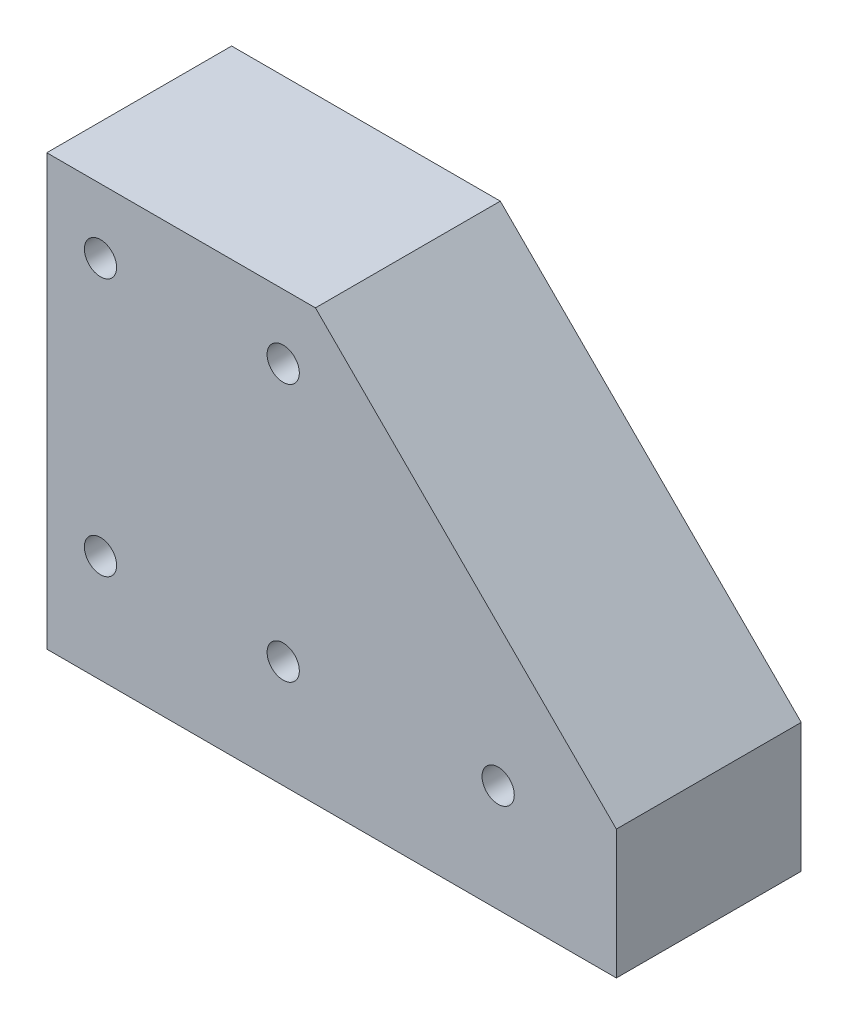
ISO-10303-21;
HEADER;
FILE_DESCRIPTION(('STEP AP214'),'2;1');
FILE_NAME('part.step','',(''),(''),'','','');
FILE_SCHEMA(('AUTOMOTIVE_DESIGN { 1 0 10303 214 1 1 1 1 }'));
ENDSEC;
DATA;
#1=APPLICATION_CONTEXT('core data for automotive mechanical design processes');
#2=APPLICATION_PROTOCOL_DEFINITION('international standard','automotive_design',2000,#1);
#3=PRODUCT_CONTEXT('',#1,'mechanical');
#4=PRODUCT('Part','Part','',(#3));
#5=PRODUCT_RELATED_PRODUCT_CATEGORY('part','',(#4));
#6=PRODUCT_DEFINITION_FORMATION('','',#4);
#7=PRODUCT_DEFINITION_CONTEXT('part definition',#1,'design');
#8=PRODUCT_DEFINITION('design','',#6,#7);
#9=PRODUCT_DEFINITION_SHAPE('','',#8);
#10=(LENGTH_UNIT() NAMED_UNIT(*) SI_UNIT(.MILLI.,.METRE.));
#11=(NAMED_UNIT(*) PLANE_ANGLE_UNIT() SI_UNIT($,.RADIAN.));
#12=(NAMED_UNIT(*) SI_UNIT($,.STERADIAN.) SOLID_ANGLE_UNIT());
#13=UNCERTAINTY_MEASURE_WITH_UNIT(LENGTH_MEASURE(1.E-05),#10,'distance_accuracy_value','');
#14=(GEOMETRIC_REPRESENTATION_CONTEXT(3) GLOBAL_UNCERTAINTY_ASSIGNED_CONTEXT((#13)) GLOBAL_UNIT_ASSIGNED_CONTEXT((#10,
#11,#12)) REPRESENTATION_CONTEXT('',''));
#15=CARTESIAN_POINT('',(0.,0.,0.));
#16=DIRECTION('',(0.,0.,1.));
#17=DIRECTION('',(1.,0.,0.));
#18=AXIS2_PLACEMENT_3D('',#15,#16,#17);
#19=CARTESIAN_POINT('',(0.,40.,17.2));
#20=DIRECTION('',(0.,-1.,0.));
#21=DIRECTION('',(0.,0.,-1.));
#22=AXIS2_PLACEMENT_3D('',#19,#20,#21);
#23=PLANE('',#22);
#24=DIRECTION('',(0.,0.,1.));
#25=VECTOR('',#24,1.);
#26=CARTESIAN_POINT('',(25.,40.,0.));
#27=LINE('',#26,#25);
#28=CARTESIAN_POINT('',(25.,40.,0.));
#29=VERTEX_POINT('',#28);
#30=CARTESIAN_POINT('',(25.,40.,17.2));
#31=VERTEX_POINT('',#30);
#32=EDGE_CURVE('E97',#29,#31,#27,.T.);
#33=ORIENTED_EDGE('',*,*,#32,.F.);
#34=DIRECTION('',(-1.,0.,0.));
#35=VECTOR('',#34,1.);
#36=CARTESIAN_POINT('',(0.,40.,0.));
#37=LINE('',#36,#35);
#38=CARTESIAN_POINT('',(0.,40.,0.));
#39=VERTEX_POINT('',#38);
#40=EDGE_CURVE('E84',#29,#39,#37,.T.);
#41=ORIENTED_EDGE('',*,*,#40,.T.);
#42=DIRECTION('',(0.,0.,-1.));
#43=VECTOR('',#42,1.);
#44=CARTESIAN_POINT('',(0.,40.,17.2));
#45=LINE('',#44,#43);
#46=CARTESIAN_POINT('',(0.,40.,17.2));
#47=VERTEX_POINT('',#46);
#48=EDGE_CURVE('E116',#47,#39,#45,.T.);
#49=ORIENTED_EDGE('',*,*,#48,.F.);
#50=DIRECTION('',(-1.,0.,0.));
#51=VECTOR('',#50,1.);
#52=CARTESIAN_POINT('',(0.,40.,17.2));
#53=LINE('',#52,#51);
#54=EDGE_CURVE('E63',#31,#47,#53,.T.);
#55=ORIENTED_EDGE('',*,*,#54,.F.);
#56=EDGE_LOOP('',(#33,#41,#49,#55));
#57=FACE_BOUND('',#56,.T.);
#58=ADVANCED_FACE('F41',(#57),#23,.F.);
#59=CARTESIAN_POINT('',(0.,0.,17.2));
#60=DIRECTION('',(0.,0.,-1.));
#61=DIRECTION('',(-1.,0.,0.));
#62=AXIS2_PLACEMENT_3D('',#59,#60,#61);
#63=PLANE('',#62);
#64=CARTESIAN_POINT('',(5.,10.,17.2));
#65=DIRECTION('',(0.,0.,1.));
#66=DIRECTION('',(1.,0.,0.));
#67=AXIS2_PLACEMENT_3D('',#64,#65,#66);
#68=CIRCLE('',#67,1.5);
#69=CARTESIAN_POINT('',(6.5,10.,17.2));
#70=VERTEX_POINT('',#69);
#71=EDGE_CURVE('E137',#70,#70,#68,.T.);
#72=ORIENTED_EDGE('',*,*,#71,.F.);
#73=EDGE_LOOP('',(#72));
#74=FACE_BOUND('',#73,.T.);
#75=CARTESIAN_POINT('',(22.,34.,17.2));
#76=DIRECTION('',(0.,0.,1.));
#77=DIRECTION('',(1.,0.,0.));
#78=AXIS2_PLACEMENT_3D('',#75,#76,#77);
#79=CIRCLE('',#78,1.5);
#80=CARTESIAN_POINT('',(23.5,34.,17.2));
#81=VERTEX_POINT('',#80);
#82=EDGE_CURVE('E144',#81,#81,#79,.T.);
#83=ORIENTED_EDGE('',*,*,#82,.F.);
#84=EDGE_LOOP('',(#83));
#85=FACE_BOUND('',#84,.T.);
#86=CARTESIAN_POINT('',(22.,10.,17.2));
#87=DIRECTION('',(0.,0.,1.));
#88=DIRECTION('',(1.,0.,0.));
#89=AXIS2_PLACEMENT_3D('',#86,#87,#88);
#90=CIRCLE('',#89,1.5);
#91=CARTESIAN_POINT('',(23.5,10.,17.2));
#92=VERTEX_POINT('',#91);
#93=EDGE_CURVE('E143',#92,#92,#90,.T.);
#94=ORIENTED_EDGE('',*,*,#93,.F.);
#95=EDGE_LOOP('',(#94));
#96=FACE_BOUND('',#95,.T.);
#97=CARTESIAN_POINT('',(42.,10.,17.2));
#98=DIRECTION('',(0.,0.,1.));
#99=DIRECTION('',(1.,0.,0.));
#100=AXIS2_PLACEMENT_3D('',#97,#98,#99);
#101=CIRCLE('',#100,1.5);
#102=CARTESIAN_POINT('',(43.5,10.,17.2));
#103=VERTEX_POINT('',#102);
#104=EDGE_CURVE('E158',#103,#103,#101,.T.);
#105=ORIENTED_EDGE('',*,*,#104,.F.);
#106=EDGE_LOOP('',(#105));
#107=FACE_BOUND('',#106,.T.);
#108=CARTESIAN_POINT('',(5.,34.,17.2));
#109=DIRECTION('',(0.,0.,1.));
#110=DIRECTION('',(1.,0.,0.));
#111=AXIS2_PLACEMENT_3D('',#108,#109,#110);
#112=CIRCLE('',#111,1.5);
#113=CARTESIAN_POINT('',(6.5,34.,17.2));
#114=VERTEX_POINT('',#113);
#115=EDGE_CURVE('E134',#114,#114,#112,.T.);
#116=ORIENTED_EDGE('',*,*,#115,.F.);
#117=EDGE_LOOP('',(#116));
#118=FACE_BOUND('',#117,.T.);
#119=DIRECTION('',(0.707106781186547,-0.707106781186547,0.));
#120=VECTOR('',#119,1.);
#121=CARTESIAN_POINT('',(53.,12.,17.2));
#122=LINE('',#121,#120);
#123=CARTESIAN_POINT('',(53.,12.,17.2));
#124=VERTEX_POINT('',#123);
#125=EDGE_CURVE('E103',#31,#124,#122,.T.);
#126=ORIENTED_EDGE('',*,*,#125,.F.);
#127=ORIENTED_EDGE('',*,*,#54,.T.);
#128=DIRECTION('',(0.,-1.,0.));
#129=VECTOR('',#128,1.);
#130=CARTESIAN_POINT('',(0.,0.,17.2));
#131=LINE('',#130,#129);
#132=CARTESIAN_POINT('',(0.,0.,17.2));
#133=VERTEX_POINT('',#132);
#134=EDGE_CURVE('E108',#47,#133,#131,.T.);
#135=ORIENTED_EDGE('',*,*,#134,.T.);
#136=DIRECTION('',(1.,0.,0.));
#137=VECTOR('',#136,1.);
#138=CARTESIAN_POINT('',(0.,0.,17.2));
#139=LINE('',#138,#137);
#140=CARTESIAN_POINT('',(53.,0.,17.2));
#141=VERTEX_POINT('',#140);
#142=EDGE_CURVE('E87',#133,#141,#139,.T.);
#143=ORIENTED_EDGE('',*,*,#142,.T.);
#144=DIRECTION('',(0.,1.,0.));
#145=VECTOR('',#144,1.);
#146=CARTESIAN_POINT('',(53.,0.,17.2));
#147=LINE('',#146,#145);
#148=EDGE_CURVE('E125',#141,#124,#147,.T.);
#149=ORIENTED_EDGE('',*,*,#148,.T.);
#150=EDGE_LOOP('',(#126,#127,#135,#143,#149));
#151=FACE_BOUND('',#150,.T.);
#152=ADVANCED_FACE('F170',(#74,#85,#96,#107,#118,#151),#63,.F.);
#153=CARTESIAN_POINT('',(0.,0.,0.));
#154=DIRECTION('',(0.,0.,-1.));
#155=DIRECTION('',(-1.,0.,0.));
#156=AXIS2_PLACEMENT_3D('',#153,#154,#155);
#157=PLANE('',#156);
#158=CARTESIAN_POINT('',(5.,10.,0.));
#159=DIRECTION('',(0.,0.,1.));
#160=DIRECTION('',(1.,0.,0.));
#161=AXIS2_PLACEMENT_3D('',#158,#159,#160);
#162=CIRCLE('',#161,1.5);
#163=CARTESIAN_POINT('',(6.5,10.,0.));
#164=VERTEX_POINT('',#163);
#165=EDGE_CURVE('E149',#164,#164,#162,.T.);
#166=ORIENTED_EDGE('',*,*,#165,.T.);
#167=EDGE_LOOP('',(#166));
#168=FACE_BOUND('',#167,.T.);
#169=CARTESIAN_POINT('',(22.,34.,0.));
#170=DIRECTION('',(0.,0.,1.));
#171=DIRECTION('',(1.,0.,0.));
#172=AXIS2_PLACEMENT_3D('',#169,#170,#171);
#173=CIRCLE('',#172,1.5);
#174=CARTESIAN_POINT('',(23.5,34.,0.));
#175=VERTEX_POINT('',#174);
#176=EDGE_CURVE('E142',#175,#175,#173,.T.);
#177=ORIENTED_EDGE('',*,*,#176,.T.);
#178=EDGE_LOOP('',(#177));
#179=FACE_BOUND('',#178,.T.);
#180=CARTESIAN_POINT('',(22.,10.,0.));
#181=DIRECTION('',(0.,0.,1.));
#182=DIRECTION('',(1.,0.,0.));
#183=AXIS2_PLACEMENT_3D('',#180,#181,#182);
#184=CIRCLE('',#183,1.5);
#185=CARTESIAN_POINT('',(23.5,10.,0.));
#186=VERTEX_POINT('',#185);
#187=EDGE_CURVE('E160',#186,#186,#184,.T.);
#188=ORIENTED_EDGE('',*,*,#187,.T.);
#189=EDGE_LOOP('',(#188));
#190=FACE_BOUND('',#189,.T.);
#191=CARTESIAN_POINT('',(42.,10.,0.));
#192=DIRECTION('',(0.,0.,1.));
#193=DIRECTION('',(1.,0.,0.));
#194=AXIS2_PLACEMENT_3D('',#191,#192,#193);
#195=CIRCLE('',#194,1.5);
#196=CARTESIAN_POINT('',(43.5,10.,0.));
#197=VERTEX_POINT('',#196);
#198=EDGE_CURVE('E152',#197,#197,#195,.T.);
#199=ORIENTED_EDGE('',*,*,#198,.T.);
#200=EDGE_LOOP('',(#199));
#201=FACE_BOUND('',#200,.T.);
#202=CARTESIAN_POINT('',(5.,34.,0.));
#203=DIRECTION('',(0.,0.,1.));
#204=DIRECTION('',(1.,0.,0.));
#205=AXIS2_PLACEMENT_3D('',#202,#203,#204);
#206=CIRCLE('',#205,1.5);
#207=CARTESIAN_POINT('',(6.5,34.,0.));
#208=VERTEX_POINT('',#207);
#209=EDGE_CURVE('E132',#208,#208,#206,.T.);
#210=ORIENTED_EDGE('',*,*,#209,.T.);
#211=EDGE_LOOP('',(#210));
#212=FACE_BOUND('',#211,.T.);
#213=ORIENTED_EDGE('',*,*,#40,.F.);
#214=DIRECTION('',(0.707106781186547,-0.707106781186547,0.));
#215=VECTOR('',#214,1.);
#216=CARTESIAN_POINT('',(53.,12.,0.));
#217=LINE('',#216,#215);
#218=CARTESIAN_POINT('',(53.,12.,0.));
#219=VERTEX_POINT('',#218);
#220=EDGE_CURVE('E91',#29,#219,#217,.T.);
#221=ORIENTED_EDGE('',*,*,#220,.T.);
#222=DIRECTION('',(0.,1.,0.));
#223=VECTOR('',#222,1.);
#224=CARTESIAN_POINT('',(53.,0.,0.));
#225=LINE('',#224,#223);
#226=CARTESIAN_POINT('',(53.,0.,0.));
#227=VERTEX_POINT('',#226);
#228=EDGE_CURVE('E107',#227,#219,#225,.T.);
#229=ORIENTED_EDGE('',*,*,#228,.F.);
#230=DIRECTION('',(1.,0.,0.));
#231=VECTOR('',#230,1.);
#232=CARTESIAN_POINT('',(0.,0.,0.));
#233=LINE('',#232,#231);
#234=CARTESIAN_POINT('',(0.,0.,0.));
#235=VERTEX_POINT('',#234);
#236=EDGE_CURVE('E115',#235,#227,#233,.T.);
#237=ORIENTED_EDGE('',*,*,#236,.F.);
#238=DIRECTION('',(0.,-1.,0.));
#239=VECTOR('',#238,1.);
#240=CARTESIAN_POINT('',(0.,0.,0.));
#241=LINE('',#240,#239);
#242=EDGE_CURVE('E101',#39,#235,#241,.T.);
#243=ORIENTED_EDGE('',*,*,#242,.F.);
#244=EDGE_LOOP('',(#213,#221,#229,#237,#243));
#245=FACE_BOUND('',#244,.T.);
#246=ADVANCED_FACE('F106',(#168,#179,#190,#201,#212,#245),#157,.T.);
#247=CARTESIAN_POINT('',(0.,0.,17.2));
#248=DIRECTION('',(1.,0.,0.));
#249=DIRECTION('',(0.,0.,-1.));
#250=AXIS2_PLACEMENT_3D('',#247,#248,#249);
#251=PLANE('',#250);
#252=ORIENTED_EDGE('',*,*,#242,.T.);
#253=DIRECTION('',(0.,0.,-1.));
#254=VECTOR('',#253,1.);
#255=CARTESIAN_POINT('',(0.,0.,17.2));
#256=LINE('',#255,#254);
#257=EDGE_CURVE('E11',#133,#235,#256,.T.);
#258=ORIENTED_EDGE('',*,*,#257,.F.);
#259=ORIENTED_EDGE('',*,*,#134,.F.);
#260=ORIENTED_EDGE('',*,*,#48,.T.);
#261=EDGE_LOOP('',(#252,#258,#259,#260));
#262=FACE_BOUND('',#261,.T.);
#263=ADVANCED_FACE('F43',(#262),#251,.F.);
#264=CARTESIAN_POINT('',(0.,0.,17.2));
#265=DIRECTION('',(0.,1.,0.));
#266=DIRECTION('',(0.,0.,1.));
#267=AXIS2_PLACEMENT_3D('',#264,#265,#266);
#268=PLANE('',#267);
#269=ORIENTED_EDGE('',*,*,#236,.T.);
#270=DIRECTION('',(0.,0.,-1.));
#271=VECTOR('',#270,1.);
#272=CARTESIAN_POINT('',(53.,0.,17.2));
#273=LINE('',#272,#271);
#274=EDGE_CURVE('E47',#141,#227,#273,.T.);
#275=ORIENTED_EDGE('',*,*,#274,.F.);
#276=ORIENTED_EDGE('',*,*,#142,.F.);
#277=ORIENTED_EDGE('',*,*,#257,.T.);
#278=EDGE_LOOP('',(#269,#275,#276,#277));
#279=FACE_BOUND('',#278,.T.);
#280=ADVANCED_FACE('F121',(#279),#268,.F.);
#281=CARTESIAN_POINT('',(53.,0.,17.2));
#282=DIRECTION('',(-1.,0.,0.));
#283=DIRECTION('',(0.,0.,1.));
#284=AXIS2_PLACEMENT_3D('',#281,#282,#283);
#285=PLANE('',#284);
#286=ORIENTED_EDGE('',*,*,#228,.T.);
#287=DIRECTION('',(0.,0.,1.));
#288=VECTOR('',#287,1.);
#289=CARTESIAN_POINT('',(53.,12.,0.));
#290=LINE('',#289,#288);
#291=EDGE_CURVE('E57',#219,#124,#290,.T.);
#292=ORIENTED_EDGE('',*,*,#291,.T.);
#293=ORIENTED_EDGE('',*,*,#148,.F.);
#294=ORIENTED_EDGE('',*,*,#274,.T.);
#295=EDGE_LOOP('',(#286,#292,#293,#294));
#296=FACE_BOUND('',#295,.T.);
#297=ADVANCED_FACE('F119',(#296),#285,.F.);
#298=CARTESIAN_POINT('',(53.,12.,0.));
#299=DIRECTION('',(-0.707106781186547,-0.707106781186547,0.));
#300=DIRECTION('',(0.707106781186548,-0.707106781186548,0.));
#301=AXIS2_PLACEMENT_3D('',#298,#299,#300);
#302=PLANE('',#301);
#303=ORIENTED_EDGE('',*,*,#125,.T.);
#304=ORIENTED_EDGE('',*,*,#291,.F.);
#305=ORIENTED_EDGE('',*,*,#220,.F.);
#306=ORIENTED_EDGE('',*,*,#32,.T.);
#307=EDGE_LOOP('',(#303,#304,#305,#306));
#308=FACE_BOUND('',#307,.T.);
#309=ADVANCED_FACE('F98',(#308),#302,.F.);
#310=CARTESIAN_POINT('',(5.,34.,0.));
#311=DIRECTION('',(0.,0.,1.));
#312=DIRECTION('',(1.,0.,0.));
#313=AXIS2_PLACEMENT_3D('',#310,#311,#312);
#314=CYLINDRICAL_SURFACE('',#313,1.5);
#315=CARTESIAN_POINT('',(6.5,34.,0.));
#316=CARTESIAN_POINT('',(6.5,34.,0.179166666666666));
#317=CARTESIAN_POINT('',(6.5,34.,0.358333333333333));
#318=CARTESIAN_POINT('',(6.5,34.,0.716666666666667));
#319=CARTESIAN_POINT('',(6.5,34.,0.895833333333333));
#320=CARTESIAN_POINT('',(6.5,34.,1.25416666666667));
#321=CARTESIAN_POINT('',(6.5,34.,1.43333333333333));
#322=CARTESIAN_POINT('',(6.5,34.,1.79166666666667));
#323=CARTESIAN_POINT('',(6.5,34.,1.97083333333333));
#324=CARTESIAN_POINT('',(6.5,34.,2.32916666666667));
#325=CARTESIAN_POINT('',(6.5,34.,2.50833333333333));
#326=CARTESIAN_POINT('',(6.5,34.,2.86666666666667));
#327=CARTESIAN_POINT('',(6.5,34.,3.04583333333333));
#328=CARTESIAN_POINT('',(6.5,34.,3.40416666666667));
#329=CARTESIAN_POINT('',(6.5,34.,3.58333333333333));
#330=CARTESIAN_POINT('',(6.5,34.,3.94166666666667));
#331=CARTESIAN_POINT('',(6.5,34.,4.12083333333333));
#332=CARTESIAN_POINT('',(6.5,34.,4.47916666666667));
#333=CARTESIAN_POINT('',(6.5,34.,4.65833333333333));
#334=CARTESIAN_POINT('',(6.5,34.,5.01666666666667));
#335=CARTESIAN_POINT('',(6.5,34.,5.19583333333333));
#336=CARTESIAN_POINT('',(6.5,34.,5.55416666666667));
#337=CARTESIAN_POINT('',(6.5,34.,5.73333333333333));
#338=CARTESIAN_POINT('',(6.5,34.,6.09166666666667));
#339=CARTESIAN_POINT('',(6.5,34.,6.27083333333333));
#340=CARTESIAN_POINT('',(6.5,34.,6.62916666666667));
#341=CARTESIAN_POINT('',(6.5,34.,6.80833333333333));
#342=CARTESIAN_POINT('',(6.5,34.,7.16666666666667));
#343=CARTESIAN_POINT('',(6.5,34.,7.34583333333333));
#344=CARTESIAN_POINT('',(6.5,34.,7.70416666666667));
#345=CARTESIAN_POINT('',(6.5,34.,7.88333333333333));
#346=CARTESIAN_POINT('',(6.5,34.,8.24166666666667));
#347=CARTESIAN_POINT('',(6.5,34.,8.42083333333333));
#348=CARTESIAN_POINT('',(6.5,34.,8.77916666666667));
#349=CARTESIAN_POINT('',(6.5,34.,8.95833333333333));
#350=CARTESIAN_POINT('',(6.5,34.,9.31666666666666));
#351=CARTESIAN_POINT('',(6.5,34.,9.49583333333333));
#352=CARTESIAN_POINT('',(6.5,34.,9.85416666666666));
#353=CARTESIAN_POINT('',(6.5,34.,10.0333333333333));
#354=CARTESIAN_POINT('',(6.5,34.,10.3916666666667));
#355=CARTESIAN_POINT('',(6.5,34.,10.5708333333333));
#356=CARTESIAN_POINT('',(6.5,34.,10.9291666666667));
#357=CARTESIAN_POINT('',(6.5,34.,11.1083333333333));
#358=CARTESIAN_POINT('',(6.5,34.,11.4666666666667));
#359=CARTESIAN_POINT('',(6.5,34.,11.6458333333333));
#360=CARTESIAN_POINT('',(6.5,34.,12.0041666666667));
#361=CARTESIAN_POINT('',(6.5,34.,12.1833333333333));
#362=CARTESIAN_POINT('',(6.5,34.,12.5416666666667));
#363=CARTESIAN_POINT('',(6.5,34.,12.7208333333333));
#364=CARTESIAN_POINT('',(6.5,34.,13.0791666666667));
#365=CARTESIAN_POINT('',(6.5,34.,13.2583333333333));
#366=CARTESIAN_POINT('',(6.5,34.,13.6166666666667));
#367=CARTESIAN_POINT('',(6.5,34.,13.7958333333333));
#368=CARTESIAN_POINT('',(6.5,34.,14.1541666666667));
#369=CARTESIAN_POINT('',(6.5,34.,14.3333333333333));
#370=CARTESIAN_POINT('',(6.5,34.,14.6916666666667));
#371=CARTESIAN_POINT('',(6.5,34.,14.8708333333333));
#372=CARTESIAN_POINT('',(6.5,34.,15.2291666666667));
#373=CARTESIAN_POINT('',(6.5,34.,15.4083333333333));
#374=CARTESIAN_POINT('',(6.5,34.,15.7666666666667));
#375=CARTESIAN_POINT('',(6.5,34.,15.9458333333333));
#376=CARTESIAN_POINT('',(6.5,34.,16.3041666666667));
#377=CARTESIAN_POINT('',(6.5,34.,16.4833333333333));
#378=CARTESIAN_POINT('',(6.5,34.,16.8416666666667));
#379=CARTESIAN_POINT('',(6.5,34.,17.0208333333333));
#380=CARTESIAN_POINT('',(6.5,34.,17.2));
#381=B_SPLINE_CURVE_WITH_KNOTS('',3,(#315,#316,#317,#318,#319,#320,#321,#322,#323,#324,#325,
#326,#327,#328,#329,#330,#331,#332,#333,#334,#335,#336,#337,#338,#339,#340,#341,#342,#343,#344,
#345,#346,#347,#348,#349,#350,#351,#352,#353,#354,#355,#356,#357,#358,#359,#360,#361,#362,#363,
#364,#365,#366,#367,#368,#369,#370,#371,#372,#373,#374,#375,#376,#377,#378,#379,#380),
.UNSPECIFIED.,.F.,.F.,(4,2,2,2,2,2,2,2,2,2,2,2,2,2,2,2,2,2,2,2,2,2,2,2,2,2,2,2,2,2,2,2,4),(0.,
0.5375,1.075,1.6125,2.15,2.6875,3.225,3.7625,4.3,4.8375,5.375,5.9125,6.45,6.9875,7.525,8.0625,
8.6,9.1375,9.675,10.2125,10.75,11.2875,11.825,12.3625,12.9,13.4375,13.975,14.5125,15.05,15.5875,
16.125,16.6625,17.2),.UNSPECIFIED.);
#382=EDGE_CURVE('BSEAM176',#208,#114,#381,.T.);
#383=ORIENTED_EDGE('',*,*,#209,.F.);
#384=ORIENTED_EDGE('',*,*,#115,.T.);
#385=ORIENTED_EDGE('',*,*,#382,.T.);
#386=ORIENTED_EDGE('',*,*,#382,.F.);
#387=EDGE_LOOP('',(#383,#385,#384,#386));
#388=FACE_BOUND('',#387,.T.);
#389=ADVANCED_FACE('F176',(#388),#314,.F.);
#390=CARTESIAN_POINT('',(42.,10.,0.));
#391=DIRECTION('',(0.,0.,1.));
#392=DIRECTION('',(1.,0.,0.));
#393=AXIS2_PLACEMENT_3D('',#390,#391,#392);
#394=CYLINDRICAL_SURFACE('',#393,1.5);
#395=CARTESIAN_POINT('',(43.5,10.,0.));
#396=CARTESIAN_POINT('',(43.5,10.,0.179166666666666));
#397=CARTESIAN_POINT('',(43.5,10.,0.358333333333333));
#398=CARTESIAN_POINT('',(43.5,10.,0.716666666666667));
#399=CARTESIAN_POINT('',(43.5,10.,0.895833333333333));
#400=CARTESIAN_POINT('',(43.5,10.,1.25416666666667));
#401=CARTESIAN_POINT('',(43.5,10.,1.43333333333333));
#402=CARTESIAN_POINT('',(43.5,10.,1.79166666666667));
#403=CARTESIAN_POINT('',(43.5,10.,1.97083333333333));
#404=CARTESIAN_POINT('',(43.5,10.,2.32916666666667));
#405=CARTESIAN_POINT('',(43.5,10.,2.50833333333333));
#406=CARTESIAN_POINT('',(43.5,10.,2.86666666666667));
#407=CARTESIAN_POINT('',(43.5,10.,3.04583333333333));
#408=CARTESIAN_POINT('',(43.5,10.,3.40416666666667));
#409=CARTESIAN_POINT('',(43.5,10.,3.58333333333333));
#410=CARTESIAN_POINT('',(43.5,10.,3.94166666666667));
#411=CARTESIAN_POINT('',(43.5,10.,4.12083333333333));
#412=CARTESIAN_POINT('',(43.5,10.,4.47916666666667));
#413=CARTESIAN_POINT('',(43.5,10.,4.65833333333333));
#414=CARTESIAN_POINT('',(43.5,10.,5.01666666666667));
#415=CARTESIAN_POINT('',(43.5,10.,5.19583333333333));
#416=CARTESIAN_POINT('',(43.5,10.,5.55416666666667));
#417=CARTESIAN_POINT('',(43.5,10.,5.73333333333333));
#418=CARTESIAN_POINT('',(43.5,10.,6.09166666666667));
#419=CARTESIAN_POINT('',(43.5,10.,6.27083333333333));
#420=CARTESIAN_POINT('',(43.5,10.,6.62916666666667));
#421=CARTESIAN_POINT('',(43.5,10.,6.80833333333333));
#422=CARTESIAN_POINT('',(43.5,10.,7.16666666666667));
#423=CARTESIAN_POINT('',(43.5,10.,7.34583333333333));
#424=CARTESIAN_POINT('',(43.5,10.,7.70416666666667));
#425=CARTESIAN_POINT('',(43.5,10.,7.88333333333333));
#426=CARTESIAN_POINT('',(43.5,10.,8.24166666666667));
#427=CARTESIAN_POINT('',(43.5,10.,8.42083333333333));
#428=CARTESIAN_POINT('',(43.5,10.,8.77916666666667));
#429=CARTESIAN_POINT('',(43.5,10.,8.95833333333333));
#430=CARTESIAN_POINT('',(43.5,10.,9.31666666666666));
#431=CARTESIAN_POINT('',(43.5,10.,9.49583333333333));
#432=CARTESIAN_POINT('',(43.5,10.,9.85416666666666));
#433=CARTESIAN_POINT('',(43.5,10.,10.0333333333333));
#434=CARTESIAN_POINT('',(43.5,10.,10.3916666666667));
#435=CARTESIAN_POINT('',(43.5,10.,10.5708333333333));
#436=CARTESIAN_POINT('',(43.5,10.,10.9291666666667));
#437=CARTESIAN_POINT('',(43.5,10.,11.1083333333333));
#438=CARTESIAN_POINT('',(43.5,10.,11.4666666666667));
#439=CARTESIAN_POINT('',(43.5,10.,11.6458333333333));
#440=CARTESIAN_POINT('',(43.5,10.,12.0041666666667));
#441=CARTESIAN_POINT('',(43.5,10.,12.1833333333333));
#442=CARTESIAN_POINT('',(43.5,10.,12.5416666666667));
#443=CARTESIAN_POINT('',(43.5,10.,12.7208333333333));
#444=CARTESIAN_POINT('',(43.5,10.,13.0791666666667));
#445=CARTESIAN_POINT('',(43.5,10.,13.2583333333333));
#446=CARTESIAN_POINT('',(43.5,10.,13.6166666666667));
#447=CARTESIAN_POINT('',(43.5,10.,13.7958333333333));
#448=CARTESIAN_POINT('',(43.5,10.,14.1541666666667));
#449=CARTESIAN_POINT('',(43.5,10.,14.3333333333333));
#450=CARTESIAN_POINT('',(43.5,10.,14.6916666666667));
#451=CARTESIAN_POINT('',(43.5,10.,14.8708333333333));
#452=CARTESIAN_POINT('',(43.5,10.,15.2291666666667));
#453=CARTESIAN_POINT('',(43.5,10.,15.4083333333333));
#454=CARTESIAN_POINT('',(43.5,10.,15.7666666666667));
#455=CARTESIAN_POINT('',(43.5,10.,15.9458333333333));
#456=CARTESIAN_POINT('',(43.5,10.,16.3041666666667));
#457=CARTESIAN_POINT('',(43.5,10.,16.4833333333333));
#458=CARTESIAN_POINT('',(43.5,10.,16.8416666666667));
#459=CARTESIAN_POINT('',(43.5,10.,17.0208333333333));
#460=CARTESIAN_POINT('',(43.5,10.,17.2));
#461=B_SPLINE_CURVE_WITH_KNOTS('',3,(#395,#396,#397,#398,#399,#400,#401,#402,#403,#404,#405,
#406,#407,#408,#409,#410,#411,#412,#413,#414,#415,#416,#417,#418,#419,#420,#421,#422,#423,#424,
#425,#426,#427,#428,#429,#430,#431,#432,#433,#434,#435,#436,#437,#438,#439,#440,#441,#442,#443,
#444,#445,#446,#447,#448,#449,#450,#451,#452,#453,#454,#455,#456,#457,#458,#459,#460),
.UNSPECIFIED.,.F.,.F.,(4,2,2,2,2,2,2,2,2,2,2,2,2,2,2,2,2,2,2,2,2,2,2,2,2,2,2,2,2,2,2,2,4),(0.,
0.5375,1.075,1.6125,2.15,2.6875,3.225,3.7625,4.3,4.8375,5.375,5.9125,6.45,6.9875,7.525,8.0625,
8.6,9.1375,9.675,10.2125,10.75,11.2875,11.825,12.3625,12.9,13.4375,13.975,14.5125,15.05,15.5875,
16.125,16.6625,17.2),.UNSPECIFIED.);
#462=EDGE_CURVE('BSEAM178',#197,#103,#461,.T.);
#463=ORIENTED_EDGE('',*,*,#198,.F.);
#464=ORIENTED_EDGE('',*,*,#104,.T.);
#465=ORIENTED_EDGE('',*,*,#462,.T.);
#466=ORIENTED_EDGE('',*,*,#462,.F.);
#467=EDGE_LOOP('',(#463,#465,#464,#466));
#468=FACE_BOUND('',#467,.T.);
#469=ADVANCED_FACE('F178',(#468),#394,.F.);
#470=CARTESIAN_POINT('',(22.,10.,0.));
#471=DIRECTION('',(0.,0.,1.));
#472=DIRECTION('',(1.,0.,0.));
#473=AXIS2_PLACEMENT_3D('',#470,#471,#472);
#474=CYLINDRICAL_SURFACE('',#473,1.5);
#475=CARTESIAN_POINT('',(23.5,10.,0.));
#476=CARTESIAN_POINT('',(23.5,10.,0.179166666666666));
#477=CARTESIAN_POINT('',(23.5,10.,0.358333333333333));
#478=CARTESIAN_POINT('',(23.5,10.,0.716666666666667));
#479=CARTESIAN_POINT('',(23.5,10.,0.895833333333333));
#480=CARTESIAN_POINT('',(23.5,10.,1.25416666666667));
#481=CARTESIAN_POINT('',(23.5,10.,1.43333333333333));
#482=CARTESIAN_POINT('',(23.5,10.,1.79166666666667));
#483=CARTESIAN_POINT('',(23.5,10.,1.97083333333333));
#484=CARTESIAN_POINT('',(23.5,10.,2.32916666666667));
#485=CARTESIAN_POINT('',(23.5,10.,2.50833333333333));
#486=CARTESIAN_POINT('',(23.5,10.,2.86666666666667));
#487=CARTESIAN_POINT('',(23.5,10.,3.04583333333333));
#488=CARTESIAN_POINT('',(23.5,10.,3.40416666666667));
#489=CARTESIAN_POINT('',(23.5,10.,3.58333333333333));
#490=CARTESIAN_POINT('',(23.5,10.,3.94166666666667));
#491=CARTESIAN_POINT('',(23.5,10.,4.12083333333333));
#492=CARTESIAN_POINT('',(23.5,10.,4.47916666666667));
#493=CARTESIAN_POINT('',(23.5,10.,4.65833333333333));
#494=CARTESIAN_POINT('',(23.5,10.,5.01666666666667));
#495=CARTESIAN_POINT('',(23.5,10.,5.19583333333333));
#496=CARTESIAN_POINT('',(23.5,10.,5.55416666666667));
#497=CARTESIAN_POINT('',(23.5,10.,5.73333333333333));
#498=CARTESIAN_POINT('',(23.5,10.,6.09166666666667));
#499=CARTESIAN_POINT('',(23.5,10.,6.27083333333333));
#500=CARTESIAN_POINT('',(23.5,10.,6.62916666666667));
#501=CARTESIAN_POINT('',(23.5,10.,6.80833333333333));
#502=CARTESIAN_POINT('',(23.5,10.,7.16666666666667));
#503=CARTESIAN_POINT('',(23.5,10.,7.34583333333333));
#504=CARTESIAN_POINT('',(23.5,10.,7.70416666666667));
#505=CARTESIAN_POINT('',(23.5,10.,7.88333333333333));
#506=CARTESIAN_POINT('',(23.5,10.,8.24166666666667));
#507=CARTESIAN_POINT('',(23.5,10.,8.42083333333333));
#508=CARTESIAN_POINT('',(23.5,10.,8.77916666666667));
#509=CARTESIAN_POINT('',(23.5,10.,8.95833333333333));
#510=CARTESIAN_POINT('',(23.5,10.,9.31666666666666));
#511=CARTESIAN_POINT('',(23.5,10.,9.49583333333333));
#512=CARTESIAN_POINT('',(23.5,10.,9.85416666666666));
#513=CARTESIAN_POINT('',(23.5,10.,10.0333333333333));
#514=CARTESIAN_POINT('',(23.5,10.,10.3916666666667));
#515=CARTESIAN_POINT('',(23.5,10.,10.5708333333333));
#516=CARTESIAN_POINT('',(23.5,10.,10.9291666666667));
#517=CARTESIAN_POINT('',(23.5,10.,11.1083333333333));
#518=CARTESIAN_POINT('',(23.5,10.,11.4666666666667));
#519=CARTESIAN_POINT('',(23.5,10.,11.6458333333333));
#520=CARTESIAN_POINT('',(23.5,10.,12.0041666666667));
#521=CARTESIAN_POINT('',(23.5,10.,12.1833333333333));
#522=CARTESIAN_POINT('',(23.5,10.,12.5416666666667));
#523=CARTESIAN_POINT('',(23.5,10.,12.7208333333333));
#524=CARTESIAN_POINT('',(23.5,10.,13.0791666666667));
#525=CARTESIAN_POINT('',(23.5,10.,13.2583333333333));
#526=CARTESIAN_POINT('',(23.5,10.,13.6166666666667));
#527=CARTESIAN_POINT('',(23.5,10.,13.7958333333333));
#528=CARTESIAN_POINT('',(23.5,10.,14.1541666666667));
#529=CARTESIAN_POINT('',(23.5,10.,14.3333333333333));
#530=CARTESIAN_POINT('',(23.5,10.,14.6916666666667));
#531=CARTESIAN_POINT('',(23.5,10.,14.8708333333333));
#532=CARTESIAN_POINT('',(23.5,10.,15.2291666666667));
#533=CARTESIAN_POINT('',(23.5,10.,15.4083333333333));
#534=CARTESIAN_POINT('',(23.5,10.,15.7666666666667));
#535=CARTESIAN_POINT('',(23.5,10.,15.9458333333333));
#536=CARTESIAN_POINT('',(23.5,10.,16.3041666666667));
#537=CARTESIAN_POINT('',(23.5,10.,16.4833333333333));
#538=CARTESIAN_POINT('',(23.5,10.,16.8416666666667));
#539=CARTESIAN_POINT('',(23.5,10.,17.0208333333333));
#540=CARTESIAN_POINT('',(23.5,10.,17.2));
#541=B_SPLINE_CURVE_WITH_KNOTS('',3,(#475,#476,#477,#478,#479,#480,#481,#482,#483,#484,#485,
#486,#487,#488,#489,#490,#491,#492,#493,#494,#495,#496,#497,#498,#499,#500,#501,#502,#503,#504,
#505,#506,#507,#508,#509,#510,#511,#512,#513,#514,#515,#516,#517,#518,#519,#520,#521,#522,#523,
#524,#525,#526,#527,#528,#529,#530,#531,#532,#533,#534,#535,#536,#537,#538,#539,#540),
.UNSPECIFIED.,.F.,.F.,(4,2,2,2,2,2,2,2,2,2,2,2,2,2,2,2,2,2,2,2,2,2,2,2,2,2,2,2,2,2,2,2,4),(0.,
0.5375,1.075,1.6125,2.15,2.6875,3.225,3.7625,4.3,4.8375,5.375,5.9125,6.45,6.9875,7.525,8.0625,
8.6,9.1375,9.675,10.2125,10.75,11.2875,11.825,12.3625,12.9,13.4375,13.975,14.5125,15.05,15.5875,
16.125,16.6625,17.2),.UNSPECIFIED.);
#542=EDGE_CURVE('BSEAM164',#186,#92,#541,.T.);
#543=ORIENTED_EDGE('',*,*,#187,.F.);
#544=ORIENTED_EDGE('',*,*,#93,.T.);
#545=ORIENTED_EDGE('',*,*,#542,.T.);
#546=ORIENTED_EDGE('',*,*,#542,.F.);
#547=EDGE_LOOP('',(#543,#545,#544,#546));
#548=FACE_BOUND('',#547,.T.);
#549=ADVANCED_FACE('F164',(#548),#474,.F.);
#550=CARTESIAN_POINT('',(22.,34.,0.));
#551=DIRECTION('',(0.,0.,1.));
#552=DIRECTION('',(1.,0.,0.));
#553=AXIS2_PLACEMENT_3D('',#550,#551,#552);
#554=CYLINDRICAL_SURFACE('',#553,1.5);
#555=CARTESIAN_POINT('',(23.5,34.,0.));
#556=CARTESIAN_POINT('',(23.5,34.,0.179166666666666));
#557=CARTESIAN_POINT('',(23.5,34.,0.358333333333333));
#558=CARTESIAN_POINT('',(23.5,34.,0.716666666666667));
#559=CARTESIAN_POINT('',(23.5,34.,0.895833333333333));
#560=CARTESIAN_POINT('',(23.5,34.,1.25416666666667));
#561=CARTESIAN_POINT('',(23.5,34.,1.43333333333333));
#562=CARTESIAN_POINT('',(23.5,34.,1.79166666666667));
#563=CARTESIAN_POINT('',(23.5,34.,1.97083333333333));
#564=CARTESIAN_POINT('',(23.5,34.,2.32916666666667));
#565=CARTESIAN_POINT('',(23.5,34.,2.50833333333333));
#566=CARTESIAN_POINT('',(23.5,34.,2.86666666666667));
#567=CARTESIAN_POINT('',(23.5,34.,3.04583333333333));
#568=CARTESIAN_POINT('',(23.5,34.,3.40416666666667));
#569=CARTESIAN_POINT('',(23.5,34.,3.58333333333333));
#570=CARTESIAN_POINT('',(23.5,34.,3.94166666666667));
#571=CARTESIAN_POINT('',(23.5,34.,4.12083333333333));
#572=CARTESIAN_POINT('',(23.5,34.,4.47916666666667));
#573=CARTESIAN_POINT('',(23.5,34.,4.65833333333333));
#574=CARTESIAN_POINT('',(23.5,34.,5.01666666666667));
#575=CARTESIAN_POINT('',(23.5,34.,5.19583333333333));
#576=CARTESIAN_POINT('',(23.5,34.,5.55416666666667));
#577=CARTESIAN_POINT('',(23.5,34.,5.73333333333333));
#578=CARTESIAN_POINT('',(23.5,34.,6.09166666666667));
#579=CARTESIAN_POINT('',(23.5,34.,6.27083333333333));
#580=CARTESIAN_POINT('',(23.5,34.,6.62916666666667));
#581=CARTESIAN_POINT('',(23.5,34.,6.80833333333333));
#582=CARTESIAN_POINT('',(23.5,34.,7.16666666666667));
#583=CARTESIAN_POINT('',(23.5,34.,7.34583333333333));
#584=CARTESIAN_POINT('',(23.5,34.,7.70416666666667));
#585=CARTESIAN_POINT('',(23.5,34.,7.88333333333333));
#586=CARTESIAN_POINT('',(23.5,34.,8.24166666666667));
#587=CARTESIAN_POINT('',(23.5,34.,8.42083333333333));
#588=CARTESIAN_POINT('',(23.5,34.,8.77916666666667));
#589=CARTESIAN_POINT('',(23.5,34.,8.95833333333333));
#590=CARTESIAN_POINT('',(23.5,34.,9.31666666666666));
#591=CARTESIAN_POINT('',(23.5,34.,9.49583333333333));
#592=CARTESIAN_POINT('',(23.5,34.,9.85416666666666));
#593=CARTESIAN_POINT('',(23.5,34.,10.0333333333333));
#594=CARTESIAN_POINT('',(23.5,34.,10.3916666666667));
#595=CARTESIAN_POINT('',(23.5,34.,10.5708333333333));
#596=CARTESIAN_POINT('',(23.5,34.,10.9291666666667));
#597=CARTESIAN_POINT('',(23.5,34.,11.1083333333333));
#598=CARTESIAN_POINT('',(23.5,34.,11.4666666666667));
#599=CARTESIAN_POINT('',(23.5,34.,11.6458333333333));
#600=CARTESIAN_POINT('',(23.5,34.,12.0041666666667));
#601=CARTESIAN_POINT('',(23.5,34.,12.1833333333333));
#602=CARTESIAN_POINT('',(23.5,34.,12.5416666666667));
#603=CARTESIAN_POINT('',(23.5,34.,12.7208333333333));
#604=CARTESIAN_POINT('',(23.5,34.,13.0791666666667));
#605=CARTESIAN_POINT('',(23.5,34.,13.2583333333333));
#606=CARTESIAN_POINT('',(23.5,34.,13.6166666666667));
#607=CARTESIAN_POINT('',(23.5,34.,13.7958333333333));
#608=CARTESIAN_POINT('',(23.5,34.,14.1541666666667));
#609=CARTESIAN_POINT('',(23.5,34.,14.3333333333333));
#610=CARTESIAN_POINT('',(23.5,34.,14.6916666666667));
#611=CARTESIAN_POINT('',(23.5,34.,14.8708333333333));
#612=CARTESIAN_POINT('',(23.5,34.,15.2291666666667));
#613=CARTESIAN_POINT('',(23.5,34.,15.4083333333333));
#614=CARTESIAN_POINT('',(23.5,34.,15.7666666666667));
#615=CARTESIAN_POINT('',(23.5,34.,15.9458333333333));
#616=CARTESIAN_POINT('',(23.5,34.,16.3041666666667));
#617=CARTESIAN_POINT('',(23.5,34.,16.4833333333333));
#618=CARTESIAN_POINT('',(23.5,34.,16.8416666666667));
#619=CARTESIAN_POINT('',(23.5,34.,17.0208333333333));
#620=CARTESIAN_POINT('',(23.5,34.,17.2));
#621=B_SPLINE_CURVE_WITH_KNOTS('',3,(#555,#556,#557,#558,#559,#560,#561,#562,#563,#564,#565,
#566,#567,#568,#569,#570,#571,#572,#573,#574,#575,#576,#577,#578,#579,#580,#581,#582,#583,#584,
#585,#586,#587,#588,#589,#590,#591,#592,#593,#594,#595,#596,#597,#598,#599,#600,#601,#602,#603,
#604,#605,#606,#607,#608,#609,#610,#611,#612,#613,#614,#615,#616,#617,#618,#619,#620),
.UNSPECIFIED.,.F.,.F.,(4,2,2,2,2,2,2,2,2,2,2,2,2,2,2,2,2,2,2,2,2,2,2,2,2,2,2,2,2,2,2,2,4),(0.,
0.5375,1.075,1.6125,2.15,2.6875,3.225,3.7625,4.3,4.8375,5.375,5.9125,6.45,6.9875,7.525,8.0625,
8.6,9.1375,9.675,10.2125,10.75,11.2875,11.825,12.3625,12.9,13.4375,13.975,14.5125,15.05,15.5875,
16.125,16.6625,17.2),.UNSPECIFIED.);
#622=EDGE_CURVE('BSEAM217',#175,#81,#621,.T.);
#623=ORIENTED_EDGE('',*,*,#176,.F.);
#624=ORIENTED_EDGE('',*,*,#82,.T.);
#625=ORIENTED_EDGE('',*,*,#622,.T.);
#626=ORIENTED_EDGE('',*,*,#622,.F.);
#627=EDGE_LOOP('',(#623,#625,#624,#626));
#628=FACE_BOUND('',#627,.T.);
#629=ADVANCED_FACE('F217',(#628),#554,.F.);
#630=CARTESIAN_POINT('',(5.,10.,0.));
#631=DIRECTION('',(0.,0.,1.));
#632=DIRECTION('',(1.,0.,0.));
#633=AXIS2_PLACEMENT_3D('',#630,#631,#632);
#634=CYLINDRICAL_SURFACE('',#633,1.5);
#635=CARTESIAN_POINT('',(6.5,10.,0.));
#636=CARTESIAN_POINT('',(6.5,10.,0.179166666666666));
#637=CARTESIAN_POINT('',(6.5,10.,0.358333333333333));
#638=CARTESIAN_POINT('',(6.5,10.,0.716666666666667));
#639=CARTESIAN_POINT('',(6.5,10.,0.895833333333333));
#640=CARTESIAN_POINT('',(6.5,10.,1.25416666666667));
#641=CARTESIAN_POINT('',(6.5,10.,1.43333333333333));
#642=CARTESIAN_POINT('',(6.5,10.,1.79166666666667));
#643=CARTESIAN_POINT('',(6.5,10.,1.97083333333333));
#644=CARTESIAN_POINT('',(6.5,10.,2.32916666666667));
#645=CARTESIAN_POINT('',(6.5,10.,2.50833333333333));
#646=CARTESIAN_POINT('',(6.5,10.,2.86666666666667));
#647=CARTESIAN_POINT('',(6.5,10.,3.04583333333333));
#648=CARTESIAN_POINT('',(6.5,10.,3.40416666666667));
#649=CARTESIAN_POINT('',(6.5,10.,3.58333333333333));
#650=CARTESIAN_POINT('',(6.5,10.,3.94166666666667));
#651=CARTESIAN_POINT('',(6.5,10.,4.12083333333333));
#652=CARTESIAN_POINT('',(6.5,10.,4.47916666666667));
#653=CARTESIAN_POINT('',(6.5,10.,4.65833333333333));
#654=CARTESIAN_POINT('',(6.5,10.,5.01666666666667));
#655=CARTESIAN_POINT('',(6.5,10.,5.19583333333333));
#656=CARTESIAN_POINT('',(6.5,10.,5.55416666666667));
#657=CARTESIAN_POINT('',(6.5,10.,5.73333333333333));
#658=CARTESIAN_POINT('',(6.5,10.,6.09166666666667));
#659=CARTESIAN_POINT('',(6.5,10.,6.27083333333333));
#660=CARTESIAN_POINT('',(6.5,10.,6.62916666666667));
#661=CARTESIAN_POINT('',(6.5,10.,6.80833333333333));
#662=CARTESIAN_POINT('',(6.5,10.,7.16666666666667));
#663=CARTESIAN_POINT('',(6.5,10.,7.34583333333333));
#664=CARTESIAN_POINT('',(6.5,10.,7.70416666666667));
#665=CARTESIAN_POINT('',(6.5,10.,7.88333333333333));
#666=CARTESIAN_POINT('',(6.5,10.,8.24166666666667));
#667=CARTESIAN_POINT('',(6.5,10.,8.42083333333333));
#668=CARTESIAN_POINT('',(6.5,10.,8.77916666666667));
#669=CARTESIAN_POINT('',(6.5,10.,8.95833333333333));
#670=CARTESIAN_POINT('',(6.5,10.,9.31666666666666));
#671=CARTESIAN_POINT('',(6.5,10.,9.49583333333333));
#672=CARTESIAN_POINT('',(6.5,10.,9.85416666666666));
#673=CARTESIAN_POINT('',(6.5,10.,10.0333333333333));
#674=CARTESIAN_POINT('',(6.5,10.,10.3916666666667));
#675=CARTESIAN_POINT('',(6.5,10.,10.5708333333333));
#676=CARTESIAN_POINT('',(6.5,10.,10.9291666666667));
#677=CARTESIAN_POINT('',(6.5,10.,11.1083333333333));
#678=CARTESIAN_POINT('',(6.5,10.,11.4666666666667));
#679=CARTESIAN_POINT('',(6.5,10.,11.6458333333333));
#680=CARTESIAN_POINT('',(6.5,10.,12.0041666666667));
#681=CARTESIAN_POINT('',(6.5,10.,12.1833333333333));
#682=CARTESIAN_POINT('',(6.5,10.,12.5416666666667));
#683=CARTESIAN_POINT('',(6.5,10.,12.7208333333333));
#684=CARTESIAN_POINT('',(6.5,10.,13.0791666666667));
#685=CARTESIAN_POINT('',(6.5,10.,13.2583333333333));
#686=CARTESIAN_POINT('',(6.5,10.,13.6166666666667));
#687=CARTESIAN_POINT('',(6.5,10.,13.7958333333333));
#688=CARTESIAN_POINT('',(6.5,10.,14.1541666666667));
#689=CARTESIAN_POINT('',(6.5,10.,14.3333333333333));
#690=CARTESIAN_POINT('',(6.5,10.,14.6916666666667));
#691=CARTESIAN_POINT('',(6.5,10.,14.8708333333333));
#692=CARTESIAN_POINT('',(6.5,10.,15.2291666666667));
#693=CARTESIAN_POINT('',(6.5,10.,15.4083333333333));
#694=CARTESIAN_POINT('',(6.5,10.,15.7666666666667));
#695=CARTESIAN_POINT('',(6.5,10.,15.9458333333333));
#696=CARTESIAN_POINT('',(6.5,10.,16.3041666666667));
#697=CARTESIAN_POINT('',(6.5,10.,16.4833333333333));
#698=CARTESIAN_POINT('',(6.5,10.,16.8416666666667));
#699=CARTESIAN_POINT('',(6.5,10.,17.0208333333333));
#700=CARTESIAN_POINT('',(6.5,10.,17.2));
#701=B_SPLINE_CURVE_WITH_KNOTS('',3,(#635,#636,#637,#638,#639,#640,#641,#642,#643,#644,#645,
#646,#647,#648,#649,#650,#651,#652,#653,#654,#655,#656,#657,#658,#659,#660,#661,#662,#663,#664,
#665,#666,#667,#668,#669,#670,#671,#672,#673,#674,#675,#676,#677,#678,#679,#680,#681,#682,#683,
#684,#685,#686,#687,#688,#689,#690,#691,#692,#693,#694,#695,#696,#697,#698,#699,#700),
.UNSPECIFIED.,.F.,.F.,(4,2,2,2,2,2,2,2,2,2,2,2,2,2,2,2,2,2,2,2,2,2,2,2,2,2,2,2,2,2,2,2,4),(0.,
0.5375,1.075,1.6125,2.15,2.6875,3.225,3.7625,4.3,4.8375,5.375,5.9125,6.45,6.9875,7.525,8.0625,
8.6,9.1375,9.675,10.2125,10.75,11.2875,11.825,12.3625,12.9,13.4375,13.975,14.5125,15.05,15.5875,
16.125,16.6625,17.2),.UNSPECIFIED.);
#702=EDGE_CURVE('BSEAM222',#164,#70,#701,.T.);
#703=ORIENTED_EDGE('',*,*,#165,.F.);
#704=ORIENTED_EDGE('',*,*,#71,.T.);
#705=ORIENTED_EDGE('',*,*,#702,.T.);
#706=ORIENTED_EDGE('',*,*,#702,.F.);
#707=EDGE_LOOP('',(#703,#705,#704,#706));
#708=FACE_BOUND('',#707,.T.);
#709=ADVANCED_FACE('F222',(#708),#634,.F.);
#710=CLOSED_SHELL('',(#58,#152,#246,#263,#280,#297,#309,#389,#469,#549,#629,#709));
#711=MANIFOLD_SOLID_BREP('B2',#710);
#712=ADVANCED_BREP_SHAPE_REPRESENTATION('',(#18,#711),#14);
#713=SHAPE_DEFINITION_REPRESENTATION(#9,#712);
ENDSEC;
END-ISO-10303-21;
